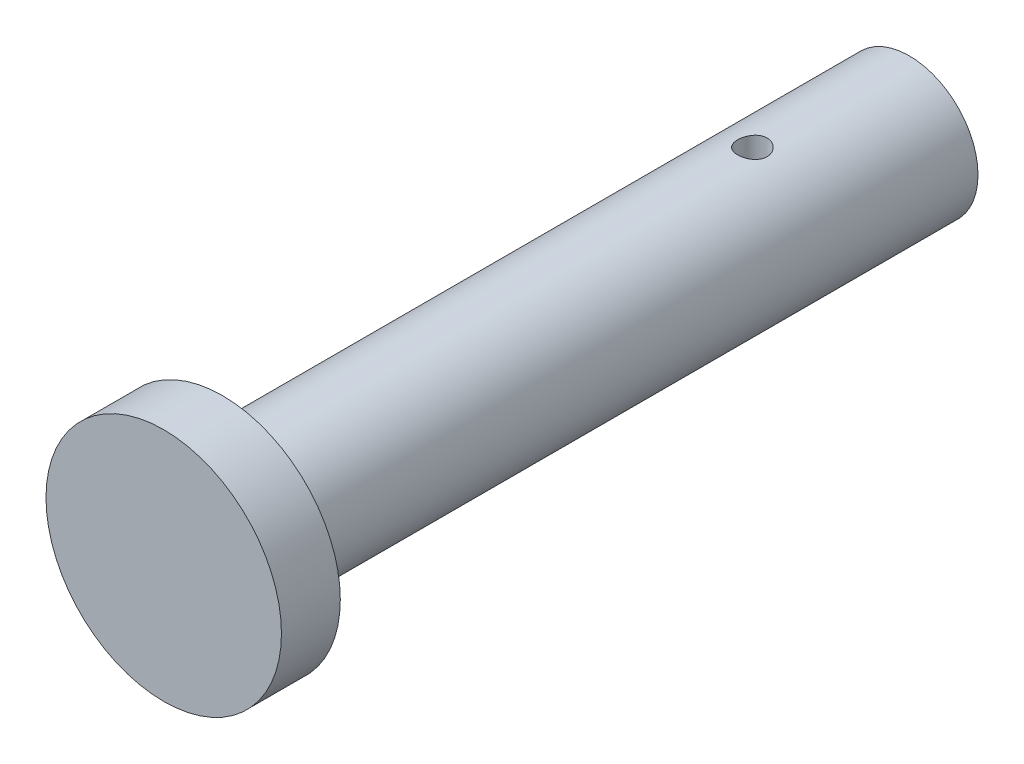
ISO-10303-21;
HEADER;
FILE_DESCRIPTION(('STEP AP214'),'2;1');
FILE_NAME('part.step','',(''),(''),'','','');
FILE_SCHEMA(('AUTOMOTIVE_DESIGN { 1 0 10303 214 1 1 1 1 }'));
ENDSEC;
DATA;
#1=APPLICATION_CONTEXT('core data for automotive mechanical design processes');
#2=APPLICATION_PROTOCOL_DEFINITION('international standard','automotive_design',2000,#1);
#3=PRODUCT_CONTEXT('',#1,'mechanical');
#4=PRODUCT('Part','Part','',(#3));
#5=PRODUCT_RELATED_PRODUCT_CATEGORY('part','',(#4));
#6=PRODUCT_DEFINITION_FORMATION('','',#4);
#7=PRODUCT_DEFINITION_CONTEXT('part definition',#1,'design');
#8=PRODUCT_DEFINITION('design','',#6,#7);
#9=PRODUCT_DEFINITION_SHAPE('','',#8);
#10=(LENGTH_UNIT() NAMED_UNIT(*) SI_UNIT(.MILLI.,.METRE.));
#11=(NAMED_UNIT(*) PLANE_ANGLE_UNIT() SI_UNIT($,.RADIAN.));
#12=(NAMED_UNIT(*) SI_UNIT($,.STERADIAN.) SOLID_ANGLE_UNIT());
#13=UNCERTAINTY_MEASURE_WITH_UNIT(LENGTH_MEASURE(1.E-05),#10,'distance_accuracy_value','');
#14=(GEOMETRIC_REPRESENTATION_CONTEXT(3) GLOBAL_UNCERTAINTY_ASSIGNED_CONTEXT((#13)) GLOBAL_UNIT_ASSIGNED_CONTEXT((#10,
#11,#12)) REPRESENTATION_CONTEXT('',''));
#15=CARTESIAN_POINT('',(0.,0.,0.));
#16=DIRECTION('',(0.,0.,1.));
#17=DIRECTION('',(1.,0.,0.));
#18=AXIS2_PLACEMENT_3D('',#15,#16,#17);
#19=CARTESIAN_POINT('',(0.,0.,35.));
#20=DIRECTION('',(0.,0.,-1.));
#21=DIRECTION('',(-1.,0.,0.));
#22=AXIS2_PLACEMENT_3D('',#19,#20,#21);
#23=CYLINDRICAL_SURFACE('',#22,3.5);
#24=CARTESIAN_POINT('',(0.,-3.5,8.75));
#25=CARTESIAN_POINT('',(0.0416179430453083,-3.49999923021613,8.74999855021285));
#26=CARTESIAN_POINT('',(0.0832535978001373,-3.49925012974855,8.74652419580608));
#27=CARTESIAN_POINT('',(0.165343672146664,-3.49633414913864,8.73273217157321));
#28=CARTESIAN_POINT('',(0.205797201785595,-3.4941662281855,8.72240947790254));
#29=CARTESIAN_POINT('',(0.284324661908868,-3.48865415894413,8.69525781769599));
#30=CARTESIAN_POINT('',(0.322400981723278,-3.48531121483585,8.67843551030935));
#31=CARTESIAN_POINT('',(0.395189088980393,-3.47781053408985,8.63878295691437));
#32=CARTESIAN_POINT('',(0.429900990873684,-3.4736528251833,8.61595291537503));
#33=CARTESIAN_POINT('',(0.495512395267614,-3.46490684623155,8.56455985016325));
#34=CARTESIAN_POINT('',(0.526352517097225,-3.4603134157163,8.53592188905074));
#35=CARTESIAN_POINT('',(0.582830211947174,-3.45125034907072,8.47388684215741));
#36=CARTESIAN_POINT('',(0.608467335754541,-3.44678072365815,8.44048934587438));
#37=CARTESIAN_POINT('',(0.654071021899042,-3.43842058023612,8.36944712356979));
#38=CARTESIAN_POINT('',(0.673974791675043,-3.4345366817218,8.3317612411219));
#39=CARTESIAN_POINT('',(0.707144118455737,-3.42786162779268,8.25348277311659));
#40=CARTESIAN_POINT('',(0.720410435008578,-3.42507034735355,8.21289052075372));
#41=CARTESIAN_POINT('',(0.739732872112272,-3.42094904463155,8.13059445670597));
#42=CARTESIAN_POINT('',(0.745893898741712,-3.41959778448243,8.08891636216807));
#43=CARTESIAN_POINT('',(0.751156976032885,-3.41844569922553,8.00509788374651));
#44=CARTESIAN_POINT('',(0.750259858323147,-3.41864469145864,7.96295755491003));
#45=CARTESIAN_POINT('',(0.741516631704306,-3.42055138301916,7.88018765603311));
#46=CARTESIAN_POINT('',(0.733791993247041,-3.42223270841081,7.83954455544993));
#47=CARTESIAN_POINT('',(0.711805271493384,-3.42687296687894,7.76014487985533));
#48=CARTESIAN_POINT('',(0.697542834682328,-3.42983196904201,7.72138840698384));
#49=CARTESIAN_POINT('',(0.662772755379956,-3.43672040377862,7.64651856356334));
#50=CARTESIAN_POINT('',(0.642218054864149,-3.44065710491682,7.61042774364373));
#51=CARTESIAN_POINT('',(0.595480036419966,-3.44905286250644,7.54216241752103));
#52=CARTESIAN_POINT('',(0.569295980517811,-3.45351198740948,7.5099884256569));
#53=CARTESIAN_POINT('',(0.511397713776602,-3.46256359196939,7.4497703221633));
#54=CARTESIAN_POINT('',(0.479580116982205,-3.46715691986089,7.42182564670764));
#55=CARTESIAN_POINT('',(0.411658653134548,-3.4758750874853,7.37165313315517));
#56=CARTESIAN_POINT('',(0.3755547143877,-3.47999991937986,7.34942539069981));
#57=CARTESIAN_POINT('',(0.299966731024979,-3.48732889267001,7.31129466004654));
#58=CARTESIAN_POINT('',(0.260476129431741,-3.49053119321677,7.29540429371101));
#59=CARTESIAN_POINT('',(0.179301573342853,-3.49564054622667,7.27051217583946));
#60=CARTESIAN_POINT('',(0.137617925566834,-3.49754777930192,7.26150946371835));
#61=CARTESIAN_POINT('',(0.0540938354183143,-3.49982653173904,7.25079189292829));
#62=CARTESIAN_POINT('',(0.0122715886358071,-3.50022668260533,7.24894114355911));
#63=CARTESIAN_POINT('',(-0.0710844868252024,-3.49952624467985,7.25221228556259));
#64=CARTESIAN_POINT('',(-0.112618334063628,-3.49842575337849,7.25733372398147));
#65=CARTESIAN_POINT('',(-0.193771268991403,-3.49486571522633,7.27429112183085));
#66=CARTESIAN_POINT('',(-0.233405856454239,-3.4924205252273,7.28605618473627));
#67=CARTESIAN_POINT('',(-0.310139225236709,-3.48644462210755,7.31588847149741));
#68=CARTESIAN_POINT('',(-0.34723779629387,-3.48291381911119,7.33395621715583));
#69=CARTESIAN_POINT('',(-0.418410698982377,-3.475087521952,7.37616677153017));
#70=CARTESIAN_POINT('',(-0.45243628755557,-3.47078215677137,7.40038989745487));
#71=CARTESIAN_POINT('',(-0.515988462761797,-3.46190516517423,7.45411741244437));
#72=CARTESIAN_POINT('',(-0.545514489345998,-3.45733350571049,7.48362245794373));
#73=CARTESIAN_POINT('',(-0.599763555289945,-3.44834086353162,7.54769868509357));
#74=CARTESIAN_POINT('',(-0.624392686275782,-3.44392396110642,7.58235004961106));
#75=CARTESIAN_POINT('',(-0.667482076930202,-3.4358332727984,7.655377298239));
#76=CARTESIAN_POINT('',(-0.685942599568528,-3.43215945524027,7.69375302348875));
#77=CARTESIAN_POINT('',(-0.716048706242738,-3.42600504903695,7.77293614949731));
#78=CARTESIAN_POINT('',(-0.727731993206375,-3.42351787291483,7.81372867821534));
#79=CARTESIAN_POINT('',(-0.744063480426676,-3.42000593354209,7.89675779191682));
#80=CARTESIAN_POINT('',(-0.748712753901288,-3.41898094719853,7.93899415560066));
#81=CARTESIAN_POINT('',(-0.750799999630202,-3.41852309424078,8.02276617158762));
#82=CARTESIAN_POINT('',(-0.748386736291555,-3.41905738259272,8.06429800749029));
#83=CARTESIAN_POINT('',(-0.736748947031653,-3.42158381592415,8.1463486210663));
#84=CARTESIAN_POINT('',(-0.727524494789894,-3.42357594513357,8.18686740969329));
#85=CARTESIAN_POINT('',(-0.702596729702167,-3.42877790552079,8.26562932893459));
#86=CARTESIAN_POINT('',(-0.686914235854432,-3.43198382112352,8.30387932433215));
#87=CARTESIAN_POINT('',(-0.649533757978002,-3.43925382295325,8.37722768625343));
#88=CARTESIAN_POINT('',(-0.627835176507497,-3.44331799440181,8.41232573930753));
#89=CARTESIAN_POINT('',(-0.578541451746518,-3.45194527796616,8.47910909686269));
#90=CARTESIAN_POINT('',(-0.550839937106183,-3.45651654969463,8.51071484797349));
#91=CARTESIAN_POINT('',(-0.49054327730981,-3.46558724899847,8.56887813126023));
#92=CARTESIAN_POINT('',(-0.457947004692798,-3.47008665975648,8.59543449715611));
#93=CARTESIAN_POINT('',(-0.388301573634358,-3.47857245524494,8.64305797975278));
#94=CARTESIAN_POINT('',(-0.35120242300482,-3.48255182285313,8.66405330311549));
#95=CARTESIAN_POINT('',(-0.273925080470299,-3.48947913052009,8.6994772644531));
#96=CARTESIAN_POINT('',(-0.233749552931939,-3.49242795106171,8.71391151129252));
#97=CARTESIAN_POINT('',(-0.161267608776601,-3.49642424230886,8.73317609256558));
#98=CARTESIAN_POINT('',(-0.129358602772989,-3.49775695944132,8.73947321699002));
#99=CARTESIAN_POINT('',(-0.0649699804269228,-3.4995451207736,8.74788565085584));
#100=CARTESIAN_POINT('',(-0.0324903875443723,-3.50000060095657,8.75000113182303));
#101=CARTESIAN_POINT('',(0.,-3.5,8.75));
#102=B_SPLINE_CURVE_WITH_KNOTS('',3,(#24,#25,#26,#27,#28,#29,#30,#31,#32,#33,#34,#35,#36,#37,
#38,#39,#40,#41,#42,#43,#44,#45,#46,#47,#48,#49,#50,#51,#52,#53,#54,#55,#56,#57,#58,#59,#60,#61,
#62,#63,#64,#65,#66,#67,#68,#69,#70,#71,#72,#73,#74,#75,#76,#77,#78,#79,#80,#81,#82,#83,#84,#85,
#86,#87,#88,#89,#90,#91,#92,#93,#94,#95,#96,#97,#98,#99,#100,#101),.UNSPECIFIED.,.T.,.F.,(4,2,2,
2,2,2,2,2,2,2,2,2,2,2,2,2,2,2,2,2,2,2,2,2,2,2,2,2,2,2,2,2,2,2,2,2,2,2,4),(0.,0.124734918256041,
0.249561441609968,0.374260412212801,0.498955139322943,0.62537480940866,0.751805389592531,
0.879572146072551,1.00732427838745,1.13316504062333,1.25899097584582,1.38262237726464,
1.50626046452284,1.63084678082984,1.75544943960444,1.88263505525145,2.00982279851175,
2.13726260569903,2.26468463628172,2.38967332852092,2.51465390115715,2.63832530294634,
2.76200694599217,2.88739366933901,3.01279598652242,3.14041031641767,3.26801920537903,
3.39491120204237,3.52178383614592,3.64600340270147,3.77022162554135,3.89404249853393,
4.01787567225812,4.14411475077057,4.27038295198557,4.39820955178611,4.52592667005135,
4.62330899566147,4.72068732668668),.UNSPECIFIED.);
#103=CARTESIAN_POINT('',(0.,-3.5,8.75));
#104=VERTEX_POINT('',#103);
#105=EDGE_CURVE('E43',#104,#104,#102,.T.);
#106=ORIENTED_EDGE('',*,*,#105,.T.);
#107=EDGE_LOOP('',(#106));
#108=FACE_BOUND('',#107,.T.);
#109=CARTESIAN_POINT('',(0.,3.5,8.75));
#110=CARTESIAN_POINT('',(-0.0416179430453083,3.49999923021613,8.74999855021285));
#111=CARTESIAN_POINT('',(-0.0832535978001373,3.49925012974855,8.74652419580608));
#112=CARTESIAN_POINT('',(-0.165343672146664,3.49633414913864,8.73273217157321));
#113=CARTESIAN_POINT('',(-0.205797201785595,3.4941662281855,8.72240947790254));
#114=CARTESIAN_POINT('',(-0.284324661908868,3.48865415894413,8.69525781769599));
#115=CARTESIAN_POINT('',(-0.322400981723278,3.48531121483585,8.67843551030935));
#116=CARTESIAN_POINT('',(-0.395189088980393,3.47781053408985,8.63878295691437));
#117=CARTESIAN_POINT('',(-0.429900990873684,3.4736528251833,8.61595291537503));
#118=CARTESIAN_POINT('',(-0.495512395267614,3.46490684623155,8.56455985016325));
#119=CARTESIAN_POINT('',(-0.526352517097225,3.4603134157163,8.53592188905074));
#120=CARTESIAN_POINT('',(-0.582830211947174,3.45125034907072,8.47388684215741));
#121=CARTESIAN_POINT('',(-0.608467335754541,3.44678072365815,8.44048934587438));
#122=CARTESIAN_POINT('',(-0.654071021899042,3.43842058023612,8.36944712356979));
#123=CARTESIAN_POINT('',(-0.673974791675043,3.4345366817218,8.3317612411219));
#124=CARTESIAN_POINT('',(-0.707144118455737,3.42786162779268,8.25348277311659));
#125=CARTESIAN_POINT('',(-0.720410435008578,3.42507034735355,8.21289052075372));
#126=CARTESIAN_POINT('',(-0.739732872112272,3.42094904463155,8.13059445670597));
#127=CARTESIAN_POINT('',(-0.745893898741712,3.41959778448243,8.08891636216807));
#128=CARTESIAN_POINT('',(-0.751156976032885,3.41844569922553,8.00509788374651));
#129=CARTESIAN_POINT('',(-0.750259858323147,3.41864469145864,7.96295755491003));
#130=CARTESIAN_POINT('',(-0.741516631704306,3.42055138301916,7.88018765603311));
#131=CARTESIAN_POINT('',(-0.733791993247041,3.42223270841081,7.83954455544993));
#132=CARTESIAN_POINT('',(-0.711805271493384,3.42687296687894,7.76014487985533));
#133=CARTESIAN_POINT('',(-0.697542834682328,3.42983196904201,7.72138840698384));
#134=CARTESIAN_POINT('',(-0.662772755379956,3.43672040377862,7.64651856356334));
#135=CARTESIAN_POINT('',(-0.642218054864149,3.44065710491682,7.61042774364373));
#136=CARTESIAN_POINT('',(-0.595480036419966,3.44905286250644,7.54216241752103));
#137=CARTESIAN_POINT('',(-0.569295980517811,3.45351198740948,7.5099884256569));
#138=CARTESIAN_POINT('',(-0.511397713776602,3.46256359196939,7.4497703221633));
#139=CARTESIAN_POINT('',(-0.479580116982205,3.46715691986089,7.42182564670764));
#140=CARTESIAN_POINT('',(-0.411658653134548,3.4758750874853,7.37165313315517));
#141=CARTESIAN_POINT('',(-0.3755547143877,3.47999991937986,7.34942539069981));
#142=CARTESIAN_POINT('',(-0.299966731024979,3.48732889267001,7.31129466004654));
#143=CARTESIAN_POINT('',(-0.260476129431741,3.49053119321677,7.29540429371101));
#144=CARTESIAN_POINT('',(-0.179301573342853,3.49564054622667,7.27051217583946));
#145=CARTESIAN_POINT('',(-0.137617925566834,3.49754777930192,7.26150946371835));
#146=CARTESIAN_POINT('',(-0.0540938354183143,3.49982653173904,7.25079189292829));
#147=CARTESIAN_POINT('',(-0.0122715886358071,3.50022668260533,7.24894114355911));
#148=CARTESIAN_POINT('',(0.0710844868252024,3.49952624467985,7.25221228556259));
#149=CARTESIAN_POINT('',(0.112618334063628,3.49842575337849,7.25733372398147));
#150=CARTESIAN_POINT('',(0.193771268991403,3.49486571522633,7.27429112183085));
#151=CARTESIAN_POINT('',(0.233405856454239,3.4924205252273,7.28605618473627));
#152=CARTESIAN_POINT('',(0.310139225236709,3.48644462210755,7.31588847149741));
#153=CARTESIAN_POINT('',(0.34723779629387,3.48291381911119,7.33395621715583));
#154=CARTESIAN_POINT('',(0.418410698982377,3.475087521952,7.37616677153017));
#155=CARTESIAN_POINT('',(0.45243628755557,3.47078215677137,7.40038989745487));
#156=CARTESIAN_POINT('',(0.515988462761797,3.46190516517423,7.45411741244437));
#157=CARTESIAN_POINT('',(0.545514489345998,3.45733350571049,7.48362245794373));
#158=CARTESIAN_POINT('',(0.599763555289945,3.44834086353162,7.54769868509357));
#159=CARTESIAN_POINT('',(0.624392686275782,3.44392396110642,7.58235004961106));
#160=CARTESIAN_POINT('',(0.667482076930202,3.4358332727984,7.655377298239));
#161=CARTESIAN_POINT('',(0.685942599568528,3.43215945524027,7.69375302348875));
#162=CARTESIAN_POINT('',(0.716048706242738,3.42600504903695,7.77293614949731));
#163=CARTESIAN_POINT('',(0.727731993206375,3.42351787291483,7.81372867821534));
#164=CARTESIAN_POINT('',(0.744063480426676,3.42000593354209,7.89675779191682));
#165=CARTESIAN_POINT('',(0.748712753901288,3.41898094719853,7.93899415560066));
#166=CARTESIAN_POINT('',(0.750799999630202,3.41852309424078,8.02276617158762));
#167=CARTESIAN_POINT('',(0.748386736291555,3.41905738259272,8.06429800749029));
#168=CARTESIAN_POINT('',(0.736748947031653,3.42158381592415,8.1463486210663));
#169=CARTESIAN_POINT('',(0.727524494789894,3.42357594513357,8.18686740969329));
#170=CARTESIAN_POINT('',(0.702596729702167,3.42877790552079,8.26562932893459));
#171=CARTESIAN_POINT('',(0.686914235854432,3.43198382112352,8.30387932433215));
#172=CARTESIAN_POINT('',(0.649533757978002,3.43925382295325,8.37722768625343));
#173=CARTESIAN_POINT('',(0.627835176507497,3.44331799440181,8.41232573930753));
#174=CARTESIAN_POINT('',(0.578541451746518,3.45194527796616,8.47910909686269));
#175=CARTESIAN_POINT('',(0.550839937106183,3.45651654969463,8.51071484797349));
#176=CARTESIAN_POINT('',(0.49054327730981,3.46558724899847,8.56887813126023));
#177=CARTESIAN_POINT('',(0.457947004692798,3.47008665975648,8.59543449715611));
#178=CARTESIAN_POINT('',(0.388301573634358,3.47857245524494,8.64305797975278));
#179=CARTESIAN_POINT('',(0.35120242300482,3.48255182285313,8.66405330311549));
#180=CARTESIAN_POINT('',(0.273925080470299,3.48947913052009,8.6994772644531));
#181=CARTESIAN_POINT('',(0.233749552931939,3.49242795106171,8.71391151129252));
#182=CARTESIAN_POINT('',(0.161267608776601,3.49642424230886,8.73317609256558));
#183=CARTESIAN_POINT('',(0.129358602772989,3.49775695944132,8.73947321699002));
#184=CARTESIAN_POINT('',(0.0649699804269228,3.4995451207736,8.74788565085584));
#185=CARTESIAN_POINT('',(0.0324903875443723,3.50000060095657,8.75000113182303));
#186=CARTESIAN_POINT('',(0.,3.5,8.75));
#187=B_SPLINE_CURVE_WITH_KNOTS('',3,(#109,#110,#111,#112,#113,#114,#115,#116,#117,#118,#119,
#120,#121,#122,#123,#124,#125,#126,#127,#128,#129,#130,#131,#132,#133,#134,#135,#136,#137,#138,
#139,#140,#141,#142,#143,#144,#145,#146,#147,#148,#149,#150,#151,#152,#153,#154,#155,#156,#157,
#158,#159,#160,#161,#162,#163,#164,#165,#166,#167,#168,#169,#170,#171,#172,#173,#174,#175,#176,
#177,#178,#179,#180,#181,#182,#183,#184,#185,#186),.UNSPECIFIED.,.T.,.F.,(4,2,2,2,2,2,2,2,2,2,2,
2,2,2,2,2,2,2,2,2,2,2,2,2,2,2,2,2,2,2,2,2,2,2,2,2,2,2,4),(0.,0.124734918256041,
0.249561441609968,0.374260412212801,0.498955139322943,0.62537480940866,0.751805389592531,
0.879572146072551,1.00732427838745,1.13316504062333,1.25899097584582,1.38262237726464,
1.50626046452284,1.63084678082984,1.75544943960444,1.88263505525145,2.00982279851175,
2.13726260569903,2.26468463628172,2.38967332852092,2.51465390115715,2.63832530294634,
2.76200694599217,2.88739366933901,3.01279598652242,3.14041031641767,3.26801920537903,
3.39491120204237,3.52178383614592,3.64600340270147,3.77022162554135,3.89404249853393,
4.01787567225812,4.14411475077057,4.27038295198557,4.39820955178611,4.52592667005135,
4.62330899566147,4.72068732668668),.UNSPECIFIED.);
#188=CARTESIAN_POINT('',(0.,3.5,8.75));
#189=VERTEX_POINT('',#188);
#190=EDGE_CURVE('E62',#189,#189,#187,.T.);
#191=ORIENTED_EDGE('',*,*,#190,.T.);
#192=EDGE_LOOP('',(#191));
#193=FACE_BOUND('',#192,.T.);
#194=CARTESIAN_POINT('',(0.,0.,35.));
#195=DIRECTION('',(0.,0.,1.));
#196=DIRECTION('',(1.,0.,0.));
#197=AXIS2_PLACEMENT_3D('',#194,#195,#196);
#198=CIRCLE('',#197,3.5);
#199=CARTESIAN_POINT('',(3.5,0.,35.));
#200=VERTEX_POINT('',#199);
#201=EDGE_CURVE('E10',#200,#200,#198,.T.);
#202=ORIENTED_EDGE('',*,*,#201,.F.);
#203=EDGE_LOOP('',(#202));
#204=FACE_BOUND('',#203,.T.);
#205=CARTESIAN_POINT('',(0.,0.,0.));
#206=DIRECTION('',(0.,0.,1.));
#207=DIRECTION('',(1.,0.,0.));
#208=AXIS2_PLACEMENT_3D('',#205,#206,#207);
#209=CIRCLE('',#208,3.5);
#210=CARTESIAN_POINT('',(3.5,0.,0.));
#211=VERTEX_POINT('',#210);
#212=EDGE_CURVE('E52',#211,#211,#209,.T.);
#213=ORIENTED_EDGE('',*,*,#212,.T.);
#214=EDGE_LOOP('',(#213));
#215=FACE_BOUND('',#214,.T.);
#216=ADVANCED_FACE('F39',(#108,#193,#204,#215),#23,.T.);
#217=CARTESIAN_POINT('',(0.,0.,0.));
#218=DIRECTION('',(0.,0.,1.));
#219=DIRECTION('',(1.,0.,0.));
#220=AXIS2_PLACEMENT_3D('',#217,#218,#219);
#221=PLANE('',#220);
#222=ORIENTED_EDGE('',*,*,#212,.F.);
#223=EDGE_LOOP('',(#222));
#224=FACE_BOUND('',#223,.T.);
#225=ADVANCED_FACE('F74',(#224),#221,.F.);
#226=CARTESIAN_POINT('',(0.,-10.,8.));
#227=DIRECTION('',(0.,1.,0.));
#228=DIRECTION('',(0.,0.,1.));
#229=AXIS2_PLACEMENT_3D('',#226,#227,#228);
#230=CYLINDRICAL_SURFACE('',#229,0.75);
#231=ORIENTED_EDGE('',*,*,#190,.F.);
#232=EDGE_LOOP('',(#231));
#233=FACE_BOUND('',#232,.T.);
#234=ORIENTED_EDGE('',*,*,#105,.F.);
#235=EDGE_LOOP('',(#234));
#236=FACE_BOUND('',#235,.T.);
#237=ADVANCED_FACE('F69',(#233,#236),#230,.F.);
#238=CARTESIAN_POINT('',(0.,0.,38.));
#239=DIRECTION('',(0.,0.,-1.));
#240=DIRECTION('',(-1.,0.,0.));
#241=AXIS2_PLACEMENT_3D('',#238,#239,#240);
#242=CYLINDRICAL_SURFACE('',#241,6.);
#243=CARTESIAN_POINT('',(0.,0.,38.));
#244=DIRECTION('',(0.,0.,1.));
#245=DIRECTION('',(1.,0.,0.));
#246=AXIS2_PLACEMENT_3D('',#243,#244,#245);
#247=CIRCLE('',#246,6.);
#248=CARTESIAN_POINT('',(6.,0.,38.));
#249=VERTEX_POINT('',#248);
#250=EDGE_CURVE('E68',#249,#249,#247,.T.);
#251=ORIENTED_EDGE('',*,*,#250,.F.);
#252=EDGE_LOOP('',(#251));
#253=FACE_BOUND('',#252,.T.);
#254=CARTESIAN_POINT('',(0.,0.,35.));
#255=DIRECTION('',(0.,0.,1.));
#256=DIRECTION('',(1.,0.,0.));
#257=AXIS2_PLACEMENT_3D('',#254,#255,#256);
#258=CIRCLE('',#257,6.);
#259=CARTESIAN_POINT('',(6.,0.,35.));
#260=VERTEX_POINT('',#259);
#261=EDGE_CURVE('E60',#260,#260,#258,.T.);
#262=ORIENTED_EDGE('',*,*,#261,.T.);
#263=EDGE_LOOP('',(#262));
#264=FACE_BOUND('',#263,.T.);
#265=ADVANCED_FACE('F73',(#253,#264),#242,.T.);
#266=CARTESIAN_POINT('',(0.,0.,38.));
#267=DIRECTION('',(0.,0.,1.));
#268=DIRECTION('',(1.,0.,0.));
#269=AXIS2_PLACEMENT_3D('',#266,#267,#268);
#270=PLANE('',#269);
#271=ORIENTED_EDGE('',*,*,#250,.T.);
#272=EDGE_LOOP('',(#271));
#273=FACE_BOUND('',#272,.T.);
#274=ADVANCED_FACE('F104',(#273),#270,.T.);
#275=CARTESIAN_POINT('',(0.,0.,35.));
#276=DIRECTION('',(0.,0.,1.));
#277=DIRECTION('',(1.,0.,0.));
#278=AXIS2_PLACEMENT_3D('',#275,#276,#277);
#279=PLANE('',#278);
#280=ORIENTED_EDGE('',*,*,#201,.T.);
#281=EDGE_LOOP('',(#280));
#282=FACE_BOUND('',#281,.T.);
#283=ORIENTED_EDGE('',*,*,#261,.F.);
#284=EDGE_LOOP('',(#283));
#285=FACE_BOUND('',#284,.T.);
#286=ADVANCED_FACE('F102',(#282,#285),#279,.F.);
#287=CLOSED_SHELL('',(#216,#225,#237,#265,#274,#286));
#288=MANIFOLD_SOLID_BREP('B2',#287);
#289=ADVANCED_BREP_SHAPE_REPRESENTATION('',(#18,#288),#14);
#290=SHAPE_DEFINITION_REPRESENTATION(#9,#289);
ENDSEC;
END-ISO-10303-21;
